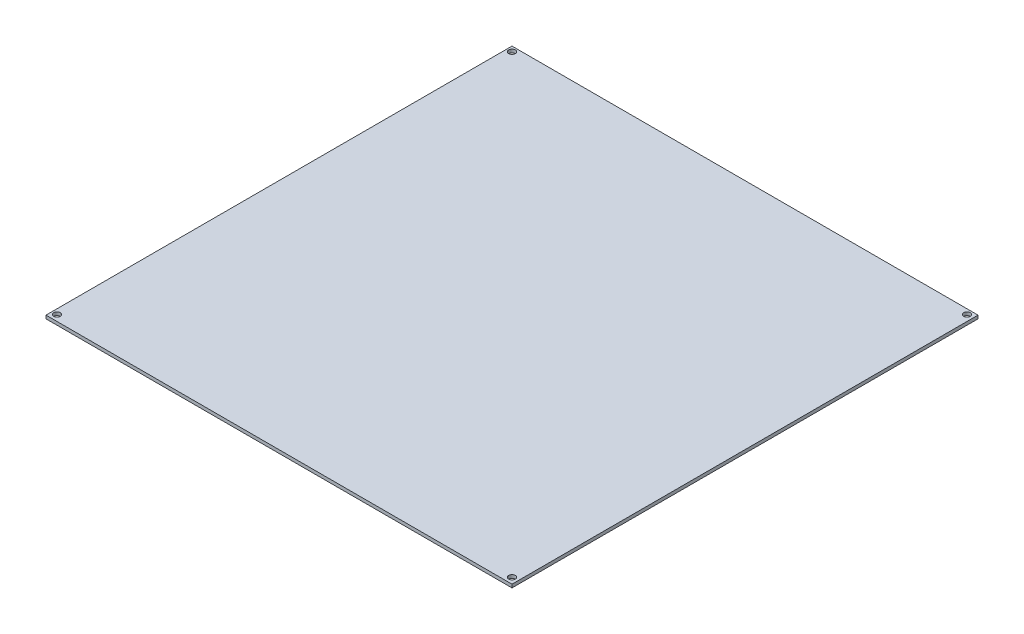
ISO-10303-21;
HEADER;
FILE_DESCRIPTION(('STEP AP214'),'2;1');
FILE_NAME('part.step','',(''),(''),'','','');
FILE_SCHEMA(('AUTOMOTIVE_DESIGN { 1 0 10303 214 1 1 1 1 }'));
ENDSEC;
DATA;
#1=APPLICATION_CONTEXT('core data for automotive mechanical design processes');
#2=APPLICATION_PROTOCOL_DEFINITION('international standard','automotive_design',2000,#1);
#3=PRODUCT_CONTEXT('',#1,'mechanical');
#4=PRODUCT('Part','Part','',(#3));
#5=PRODUCT_RELATED_PRODUCT_CATEGORY('part','',(#4));
#6=PRODUCT_DEFINITION_FORMATION('','',#4);
#7=PRODUCT_DEFINITION_CONTEXT('part definition',#1,'design');
#8=PRODUCT_DEFINITION('design','',#6,#7);
#9=PRODUCT_DEFINITION_SHAPE('','',#8);
#10=(LENGTH_UNIT() NAMED_UNIT(*) SI_UNIT(.MILLI.,.METRE.));
#11=(NAMED_UNIT(*) PLANE_ANGLE_UNIT() SI_UNIT($,.RADIAN.));
#12=(NAMED_UNIT(*) SI_UNIT($,.STERADIAN.) SOLID_ANGLE_UNIT());
#13=UNCERTAINTY_MEASURE_WITH_UNIT(LENGTH_MEASURE(1.E-05),#10,'distance_accuracy_value','');
#14=(GEOMETRIC_REPRESENTATION_CONTEXT(3) GLOBAL_UNCERTAINTY_ASSIGNED_CONTEXT((#13)) GLOBAL_UNIT_ASSIGNED_CONTEXT((#10,
#11,#12)) REPRESENTATION_CONTEXT('',''));
#15=CARTESIAN_POINT('',(0.,0.,0.));
#16=DIRECTION('',(0.,0.,1.));
#17=DIRECTION('',(1.,0.,0.));
#18=AXIS2_PLACEMENT_3D('',#15,#16,#17);
#19=CARTESIAN_POINT('',(0.,1.5,0.));
#20=DIRECTION('',(0.,1.,0.));
#21=DIRECTION('',(0.,0.,1.));
#22=AXIS2_PLACEMENT_3D('',#19,#20,#21);
#23=PLANE('',#22);
#24=CARTESIAN_POINT('',(-122.793137254902,1.5,149.567647058824));
#25=DIRECTION('',(0.,1.,0.));
#26=DIRECTION('',(0.,0.,1.));
#27=AXIS2_PLACEMENT_3D('',#24,#25,#26);
#28=CIRCLE('',#27,1.5);
#29=CARTESIAN_POINT('',(-122.793137254902,1.5,151.067647058824));
#30=VERTEX_POINT('',#29);
#31=EDGE_CURVE('E123',#30,#30,#28,.T.);
#32=ORIENTED_EDGE('',*,*,#31,.F.);
#33=EDGE_LOOP('',(#32));
#34=FACE_BOUND('',#33,.T.);
#35=CARTESIAN_POINT('',(-122.793137254902,1.5,-59.4323529411764));
#36=DIRECTION('',(0.,1.,0.));
#37=DIRECTION('',(0.,0.,1.));
#38=AXIS2_PLACEMENT_3D('',#35,#36,#37);
#39=CIRCLE('',#38,1.5);
#40=CARTESIAN_POINT('',(-122.793137254902,1.5,-57.9323529411765));
#41=VERTEX_POINT('',#40);
#42=EDGE_CURVE('E102',#41,#41,#39,.T.);
#43=ORIENTED_EDGE('',*,*,#42,.F.);
#44=EDGE_LOOP('',(#43));
#45=FACE_BOUND('',#44,.T.);
#46=DIRECTION('',(0.,0.,1.));
#47=VECTOR('',#46,1.);
#48=CARTESIAN_POINT('',(-125.043137254902,1.5,-61.6823529411765));
#49=LINE('',#48,#47);
#50=CARTESIAN_POINT('',(-125.043137254902,1.5,-61.6823529411765));
#51=VERTEX_POINT('',#50);
#52=CARTESIAN_POINT('',(-125.043137254902,1.5,152.317647058824));
#53=VERTEX_POINT('',#52);
#54=EDGE_CURVE('E87',#51,#53,#49,.T.);
#55=ORIENTED_EDGE('',*,*,#54,.T.);
#56=DIRECTION('',(1.,0.,0.));
#57=VECTOR('',#56,1.);
#58=CARTESIAN_POINT('',(-125.043137254902,1.5,152.317647058824));
#59=LINE('',#58,#57);
#60=CARTESIAN_POINT('',(88.9568627450981,1.5,152.317647058824));
#61=VERTEX_POINT('',#60);
#62=EDGE_CURVE('E82',#53,#61,#59,.T.);
#63=ORIENTED_EDGE('',*,*,#62,.T.);
#64=DIRECTION('',(0.,0.,-1.));
#65=VECTOR('',#64,1.);
#66=CARTESIAN_POINT('',(88.9568627450981,1.5,-61.6823529411765));
#67=LINE('',#66,#65);
#68=CARTESIAN_POINT('',(88.9568627450981,1.5,-61.6823529411765));
#69=VERTEX_POINT('',#68);
#70=EDGE_CURVE('E85',#61,#69,#67,.T.);
#71=ORIENTED_EDGE('',*,*,#70,.T.);
#72=DIRECTION('',(-1.,0.,0.));
#73=VECTOR('',#72,1.);
#74=CARTESIAN_POINT('',(-125.043137254902,1.5,-61.6823529411765));
#75=LINE('',#74,#73);
#76=EDGE_CURVE('E52',#69,#51,#75,.T.);
#77=ORIENTED_EDGE('',*,*,#76,.T.);
#78=EDGE_LOOP('',(#55,#63,#71,#77));
#79=FACE_BOUND('',#78,.T.);
#80=CARTESIAN_POINT('',(86.2068627450981,1.5,-59.4323529411764));
#81=DIRECTION('',(0.,1.,0.));
#82=DIRECTION('',(0.,0.,1.));
#83=AXIS2_PLACEMENT_3D('',#80,#81,#82);
#84=CIRCLE('',#83,1.5);
#85=CARTESIAN_POINT('',(86.2068627450981,1.5,-57.9323529411764));
#86=VERTEX_POINT('',#85);
#87=EDGE_CURVE('E117',#86,#86,#84,.T.);
#88=ORIENTED_EDGE('',*,*,#87,.F.);
#89=EDGE_LOOP('',(#88));
#90=FACE_BOUND('',#89,.T.);
#91=CARTESIAN_POINT('',(86.2068627450981,1.5,149.567647058824));
#92=DIRECTION('',(0.,1.,0.));
#93=DIRECTION('',(0.,0.,1.));
#94=AXIS2_PLACEMENT_3D('',#91,#92,#93);
#95=CIRCLE('',#94,1.5);
#96=CARTESIAN_POINT('',(86.2068627450981,1.5,151.067647058824));
#97=VERTEX_POINT('',#96);
#98=EDGE_CURVE('E129',#97,#97,#95,.T.);
#99=ORIENTED_EDGE('',*,*,#98,.F.);
#100=EDGE_LOOP('',(#99));
#101=FACE_BOUND('',#100,.T.);
#102=ADVANCED_FACE('F35',(#34,#45,#79,#90,#101),#23,.T.);
#103=CARTESIAN_POINT('',(0.,0.,0.));
#104=DIRECTION('',(0.,1.,0.));
#105=DIRECTION('',(0.,0.,1.));
#106=AXIS2_PLACEMENT_3D('',#103,#104,#105);
#107=PLANE('',#106);
#108=CARTESIAN_POINT('',(-122.793137254902,0.,149.567647058824));
#109=DIRECTION('',(0.,1.,0.));
#110=DIRECTION('',(0.,0.,1.));
#111=AXIS2_PLACEMENT_3D('',#108,#109,#110);
#112=CIRCLE('',#111,1.5);
#113=CARTESIAN_POINT('',(-122.793137254902,0.,151.067647058824));
#114=VERTEX_POINT('',#113);
#115=EDGE_CURVE('E126',#114,#114,#112,.T.);
#116=ORIENTED_EDGE('',*,*,#115,.T.);
#117=EDGE_LOOP('',(#116));
#118=FACE_BOUND('',#117,.T.);
#119=CARTESIAN_POINT('',(-122.793137254902,0.,-59.4323529411764));
#120=DIRECTION('',(0.,1.,0.));
#121=DIRECTION('',(0.,0.,1.));
#122=AXIS2_PLACEMENT_3D('',#119,#120,#121);
#123=CIRCLE('',#122,1.5);
#124=CARTESIAN_POINT('',(-122.793137254902,0.,-57.9323529411765));
#125=VERTEX_POINT('',#124);
#126=EDGE_CURVE('E114',#125,#125,#123,.T.);
#127=ORIENTED_EDGE('',*,*,#126,.T.);
#128=EDGE_LOOP('',(#127));
#129=FACE_BOUND('',#128,.T.);
#130=DIRECTION('',(0.,0.,1.));
#131=VECTOR('',#130,1.);
#132=CARTESIAN_POINT('',(-125.043137254902,0.,-61.6823529411765));
#133=LINE('',#132,#131);
#134=CARTESIAN_POINT('',(-125.043137254902,0.,-61.6823529411765));
#135=VERTEX_POINT('',#134);
#136=CARTESIAN_POINT('',(-125.043137254902,0.,152.317647058824));
#137=VERTEX_POINT('',#136);
#138=EDGE_CURVE('E99',#135,#137,#133,.T.);
#139=ORIENTED_EDGE('',*,*,#138,.F.);
#140=DIRECTION('',(-1.,0.,0.));
#141=VECTOR('',#140,1.);
#142=CARTESIAN_POINT('',(-125.043137254902,0.,-61.6823529411765));
#143=LINE('',#142,#141);
#144=CARTESIAN_POINT('',(88.9568627450981,0.,-61.6823529411765));
#145=VERTEX_POINT('',#144);
#146=EDGE_CURVE('E75',#145,#135,#143,.T.);
#147=ORIENTED_EDGE('',*,*,#146,.F.);
#148=DIRECTION('',(0.,0.,-1.));
#149=VECTOR('',#148,1.);
#150=CARTESIAN_POINT('',(88.9568627450981,0.,-61.6823529411765));
#151=LINE('',#150,#149);
#152=CARTESIAN_POINT('',(88.9568627450981,0.,152.317647058824));
#153=VERTEX_POINT('',#152);
#154=EDGE_CURVE('E69',#153,#145,#151,.T.);
#155=ORIENTED_EDGE('',*,*,#154,.F.);
#156=DIRECTION('',(1.,0.,0.));
#157=VECTOR('',#156,1.);
#158=CARTESIAN_POINT('',(-125.043137254902,0.,152.317647058824));
#159=LINE('',#158,#157);
#160=EDGE_CURVE('E91',#137,#153,#159,.T.);
#161=ORIENTED_EDGE('',*,*,#160,.F.);
#162=EDGE_LOOP('',(#139,#147,#155,#161));
#163=FACE_BOUND('',#162,.T.);
#164=CARTESIAN_POINT('',(86.2068627450981,0.,-59.4323529411764));
#165=DIRECTION('',(0.,1.,0.));
#166=DIRECTION('',(0.,0.,1.));
#167=AXIS2_PLACEMENT_3D('',#164,#165,#166);
#168=CIRCLE('',#167,1.5);
#169=CARTESIAN_POINT('',(86.2068627450981,0.,-57.9323529411764));
#170=VERTEX_POINT('',#169);
#171=EDGE_CURVE('E120',#170,#170,#168,.T.);
#172=ORIENTED_EDGE('',*,*,#171,.T.);
#173=EDGE_LOOP('',(#172));
#174=FACE_BOUND('',#173,.T.);
#175=CARTESIAN_POINT('',(86.2068627450981,0.,149.567647058824));
#176=DIRECTION('',(0.,1.,0.));
#177=DIRECTION('',(0.,0.,1.));
#178=AXIS2_PLACEMENT_3D('',#175,#176,#177);
#179=CIRCLE('',#178,1.5);
#180=CARTESIAN_POINT('',(86.2068627450981,0.,151.067647058824));
#181=VERTEX_POINT('',#180);
#182=EDGE_CURVE('E132',#181,#181,#179,.T.);
#183=ORIENTED_EDGE('',*,*,#182,.T.);
#184=EDGE_LOOP('',(#183));
#185=FACE_BOUND('',#184,.T.);
#186=ADVANCED_FACE('F110',(#118,#129,#163,#174,#185),#107,.F.);
#187=CARTESIAN_POINT('',(-125.043137254902,1.5,-61.6823529411765));
#188=DIRECTION('',(1.,0.,0.));
#189=DIRECTION('',(0.,0.,-1.));
#190=AXIS2_PLACEMENT_3D('',#187,#188,#189);
#191=PLANE('',#190);
#192=ORIENTED_EDGE('',*,*,#138,.T.);
#193=DIRECTION('',(0.,-1.,0.));
#194=VECTOR('',#193,1.);
#195=CARTESIAN_POINT('',(-125.043137254902,1.5,152.317647058824));
#196=LINE('',#195,#194);
#197=EDGE_CURVE('E11',#53,#137,#196,.T.);
#198=ORIENTED_EDGE('',*,*,#197,.F.);
#199=ORIENTED_EDGE('',*,*,#54,.F.);
#200=DIRECTION('',(0.,-1.,0.));
#201=VECTOR('',#200,1.);
#202=CARTESIAN_POINT('',(-125.043137254902,1.5,-61.6823529411765));
#203=LINE('',#202,#201);
#204=EDGE_CURVE('E95',#51,#135,#203,.T.);
#205=ORIENTED_EDGE('',*,*,#204,.T.);
#206=EDGE_LOOP('',(#192,#198,#199,#205));
#207=FACE_BOUND('',#206,.T.);
#208=ADVANCED_FACE('F37',(#207),#191,.F.);
#209=CARTESIAN_POINT('',(-125.043137254902,1.5,152.317647058824));
#210=DIRECTION('',(0.,0.,-1.));
#211=DIRECTION('',(-1.,0.,0.));
#212=AXIS2_PLACEMENT_3D('',#209,#210,#211);
#213=PLANE('',#212);
#214=ORIENTED_EDGE('',*,*,#160,.T.);
#215=DIRECTION('',(0.,-1.,0.));
#216=VECTOR('',#215,1.);
#217=CARTESIAN_POINT('',(88.9568627450981,1.5,152.317647058824));
#218=LINE('',#217,#216);
#219=EDGE_CURVE('E44',#61,#153,#218,.T.);
#220=ORIENTED_EDGE('',*,*,#219,.F.);
#221=ORIENTED_EDGE('',*,*,#62,.F.);
#222=ORIENTED_EDGE('',*,*,#197,.T.);
#223=EDGE_LOOP('',(#214,#220,#221,#222));
#224=FACE_BOUND('',#223,.T.);
#225=ADVANCED_FACE('F90',(#224),#213,.F.);
#226=CARTESIAN_POINT('',(88.9568627450981,1.5,-61.6823529411765));
#227=DIRECTION('',(-1.,0.,0.));
#228=DIRECTION('',(0.,0.,1.));
#229=AXIS2_PLACEMENT_3D('',#226,#227,#228);
#230=PLANE('',#229);
#231=ORIENTED_EDGE('',*,*,#154,.T.);
#232=DIRECTION('',(0.,-1.,0.));
#233=VECTOR('',#232,1.);
#234=CARTESIAN_POINT('',(88.9568627450981,1.5,-61.6823529411765));
#235=LINE('',#234,#233);
#236=EDGE_CURVE('E92',#69,#145,#235,.T.);
#237=ORIENTED_EDGE('',*,*,#236,.F.);
#238=ORIENTED_EDGE('',*,*,#70,.F.);
#239=ORIENTED_EDGE('',*,*,#219,.T.);
#240=EDGE_LOOP('',(#231,#237,#238,#239));
#241=FACE_BOUND('',#240,.T.);
#242=ADVANCED_FACE('F93',(#241),#230,.F.);
#243=CARTESIAN_POINT('',(-125.043137254902,1.5,-61.6823529411765));
#244=DIRECTION('',(0.,0.,1.));
#245=DIRECTION('',(1.,0.,0.));
#246=AXIS2_PLACEMENT_3D('',#243,#244,#245);
#247=PLANE('',#246);
#248=ORIENTED_EDGE('',*,*,#146,.T.);
#249=ORIENTED_EDGE('',*,*,#204,.F.);
#250=ORIENTED_EDGE('',*,*,#76,.F.);
#251=ORIENTED_EDGE('',*,*,#236,.T.);
#252=EDGE_LOOP('',(#248,#249,#250,#251));
#253=FACE_BOUND('',#252,.T.);
#254=ADVANCED_FACE('F107',(#253),#247,.F.);
#255=CARTESIAN_POINT('',(-122.793137254902,1.5,-59.4323529411764));
#256=DIRECTION('',(0.,-1.,0.));
#257=DIRECTION('',(0.,0.,-1.));
#258=AXIS2_PLACEMENT_3D('',#255,#256,#257);
#259=CYLINDRICAL_SURFACE('',#258,1.5);
#260=ORIENTED_EDGE('',*,*,#42,.T.);
#261=EDGE_LOOP('',(#260));
#262=FACE_BOUND('',#261,.T.);
#263=ORIENTED_EDGE('',*,*,#126,.F.);
#264=EDGE_LOOP('',(#263));
#265=FACE_BOUND('',#264,.T.);
#266=ADVANCED_FACE('F152',(#262,#265),#259,.F.);
#267=CARTESIAN_POINT('',(86.2068627450981,1.5,-59.4323529411764));
#268=DIRECTION('',(0.,-1.,0.));
#269=DIRECTION('',(0.,0.,-1.));
#270=AXIS2_PLACEMENT_3D('',#267,#268,#269);
#271=CYLINDRICAL_SURFACE('',#270,1.5);
#272=ORIENTED_EDGE('',*,*,#87,.T.);
#273=EDGE_LOOP('',(#272));
#274=FACE_BOUND('',#273,.T.);
#275=ORIENTED_EDGE('',*,*,#171,.F.);
#276=EDGE_LOOP('',(#275));
#277=FACE_BOUND('',#276,.T.);
#278=ADVANCED_FACE('F198',(#274,#277),#271,.F.);
#279=CARTESIAN_POINT('',(-122.793137254902,1.5,149.567647058824));
#280=DIRECTION('',(0.,-1.,0.));
#281=DIRECTION('',(0.,0.,-1.));
#282=AXIS2_PLACEMENT_3D('',#279,#280,#281);
#283=CYLINDRICAL_SURFACE('',#282,1.5);
#284=ORIENTED_EDGE('',*,*,#31,.T.);
#285=EDGE_LOOP('',(#284));
#286=FACE_BOUND('',#285,.T.);
#287=ORIENTED_EDGE('',*,*,#115,.F.);
#288=EDGE_LOOP('',(#287));
#289=FACE_BOUND('',#288,.T.);
#290=ADVANCED_FACE('F206',(#286,#289),#283,.F.);
#291=CARTESIAN_POINT('',(86.2068627450981,1.5,149.567647058824));
#292=DIRECTION('',(0.,-1.,0.));
#293=DIRECTION('',(0.,0.,-1.));
#294=AXIS2_PLACEMENT_3D('',#291,#292,#293);
#295=CYLINDRICAL_SURFACE('',#294,1.5);
#296=ORIENTED_EDGE('',*,*,#98,.T.);
#297=EDGE_LOOP('',(#296));
#298=FACE_BOUND('',#297,.T.);
#299=ORIENTED_EDGE('',*,*,#182,.F.);
#300=EDGE_LOOP('',(#299));
#301=FACE_BOUND('',#300,.T.);
#302=ADVANCED_FACE('F138',(#298,#301),#295,.F.);
#303=CLOSED_SHELL('',(#102,#186,#208,#225,#242,#254,#266,#278,#290,#302));
#304=MANIFOLD_SOLID_BREP('B2',#303);
#305=ADVANCED_BREP_SHAPE_REPRESENTATION('',(#18,#304),#14);
#306=SHAPE_DEFINITION_REPRESENTATION(#9,#305);
ENDSEC;
END-ISO-10303-21;
